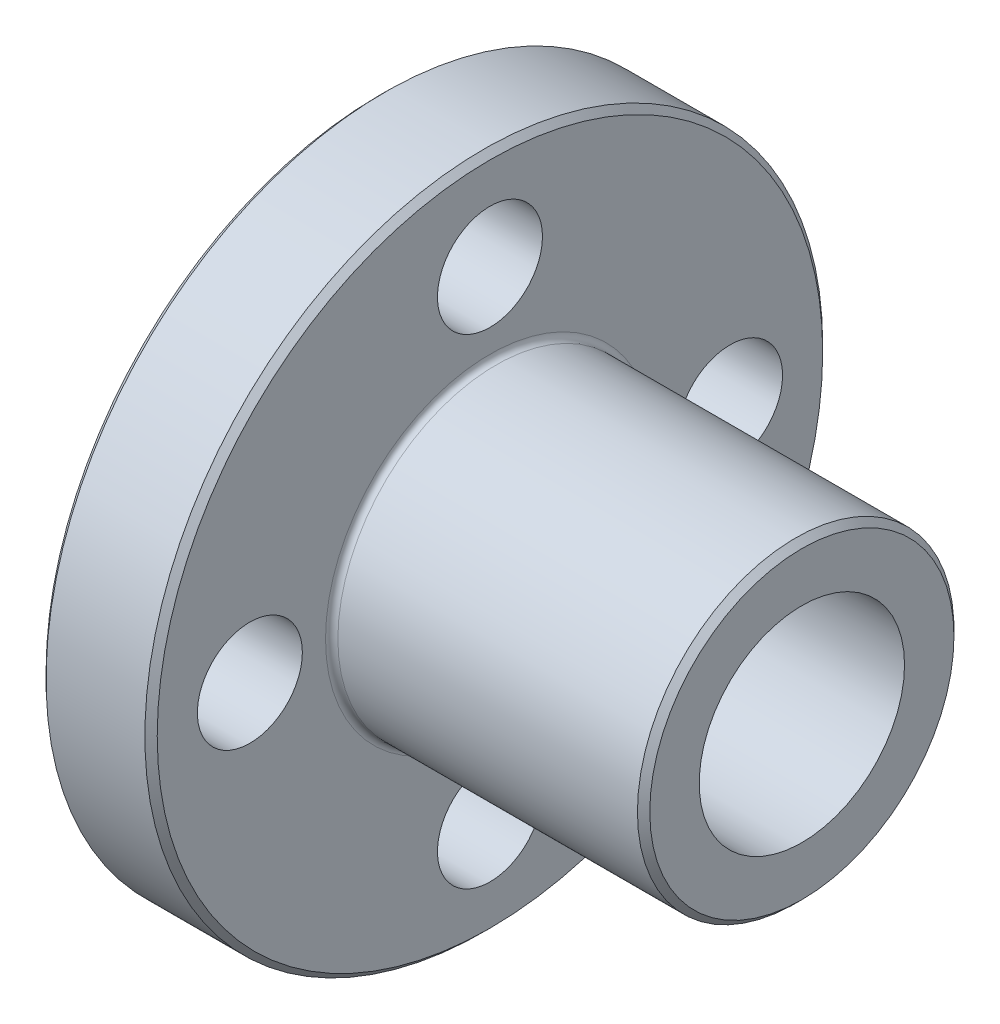
ISO-10303-21;
HEADER;
FILE_DESCRIPTION(('STEP AP214'),'2;1');
FILE_NAME('part.step','',(''),(''),'','','');
FILE_SCHEMA(('AUTOMOTIVE_DESIGN { 1 0 10303 214 1 1 1 1 }'));
ENDSEC;
DATA;
#1=APPLICATION_CONTEXT('core data for automotive mechanical design processes');
#2=APPLICATION_PROTOCOL_DEFINITION('international standard','automotive_design',2000,#1);
#3=PRODUCT_CONTEXT('',#1,'mechanical');
#4=PRODUCT('Part','Part','',(#3));
#5=PRODUCT_RELATED_PRODUCT_CATEGORY('part','',(#4));
#6=PRODUCT_DEFINITION_FORMATION('','',#4);
#7=PRODUCT_DEFINITION_CONTEXT('part definition',#1,'design');
#8=PRODUCT_DEFINITION('design','',#6,#7);
#9=PRODUCT_DEFINITION_SHAPE('','',#8);
#10=(LENGTH_UNIT() NAMED_UNIT(*) SI_UNIT(.MILLI.,.METRE.));
#11=(NAMED_UNIT(*) PLANE_ANGLE_UNIT() SI_UNIT($,.RADIAN.));
#12=(NAMED_UNIT(*) SI_UNIT($,.STERADIAN.) SOLID_ANGLE_UNIT());
#13=UNCERTAINTY_MEASURE_WITH_UNIT(LENGTH_MEASURE(1.E-05),#10,'distance_accuracy_value','');
#14=(GEOMETRIC_REPRESENTATION_CONTEXT(3) GLOBAL_UNCERTAINTY_ASSIGNED_CONTEXT((#13)) GLOBAL_UNIT_ASSIGNED_CONTEXT((#10,
#11,#12)) REPRESENTATION_CONTEXT('',''));
#15=CARTESIAN_POINT('',(0.,0.,0.));
#16=DIRECTION('',(0.,0.,1.));
#17=DIRECTION('',(1.,0.,0.));
#18=AXIS2_PLACEMENT_3D('',#15,#16,#17);
#19=CARTESIAN_POINT('',(3.6,0.,0.));
#20=DIRECTION('',(1.,0.,0.));
#21=DIRECTION('',(0.,0.,-1.));
#22=AXIS2_PLACEMENT_3D('',#19,#20,#21);
#23=PLANE('',#22);
#24=CARTESIAN_POINT('',(3.6,0.,0.));
#25=DIRECTION('',(1.,0.,0.));
#26=DIRECTION('',(0.,0.,-1.));
#27=AXIS2_PLACEMENT_3D('',#24,#25,#26);
#28=CIRCLE('',#27,10.775);
#29=CARTESIAN_POINT('',(3.6,0.,-10.775));
#30=VERTEX_POINT('',#29);
#31=EDGE_CURVE('E10',#30,#30,#28,.T.);
#32=ORIENTED_EDGE('',*,*,#31,.T.);
#33=EDGE_LOOP('',(#32));
#34=FACE_BOUND('',#33,.T.);
#35=CARTESIAN_POINT('',(3.6,0.,0.));
#36=DIRECTION('',(1.,0.,0.));
#37=DIRECTION('',(0.,0.,-1.));
#38=AXIS2_PLACEMENT_3D('',#35,#36,#37);
#39=CIRCLE('',#38,5.325);
#40=CARTESIAN_POINT('',(3.6,0.,-5.325));
#41=VERTEX_POINT('',#40);
#42=EDGE_CURVE('E76',#41,#41,#39,.F.);
#43=ORIENTED_EDGE('',*,*,#42,.T.);
#44=EDGE_LOOP('',(#43));
#45=FACE_BOUND('',#44,.T.);
#46=CARTESIAN_POINT('',(3.6,-7.775,0.));
#47=DIRECTION('',(1.,0.,0.));
#48=DIRECTION('',(0.,0.,-1.));
#49=AXIS2_PLACEMENT_3D('',#46,#47,#48);
#50=CIRCLE('',#49,1.7);
#51=CARTESIAN_POINT('',(3.6,-7.775,-1.7));
#52=VERTEX_POINT('',#51);
#53=EDGE_CURVE('E93',#52,#52,#50,.T.);
#54=ORIENTED_EDGE('',*,*,#53,.F.);
#55=EDGE_LOOP('',(#54));
#56=FACE_BOUND('',#55,.T.);
#57=CARTESIAN_POINT('',(3.6,7.775,0.));
#58=DIRECTION('',(1.,0.,0.));
#59=DIRECTION('',(0.,0.,-1.));
#60=AXIS2_PLACEMENT_3D('',#57,#58,#59);
#61=CIRCLE('',#60,1.7);
#62=CARTESIAN_POINT('',(3.6,7.775,-1.7));
#63=VERTEX_POINT('',#62);
#64=EDGE_CURVE('E80',#63,#63,#61,.T.);
#65=ORIENTED_EDGE('',*,*,#64,.F.);
#66=EDGE_LOOP('',(#65));
#67=FACE_BOUND('',#66,.T.);
#68=CARTESIAN_POINT('',(3.6,0.,-7.77500000000001));
#69=DIRECTION('',(1.,0.,0.));
#70=DIRECTION('',(0.,0.,-1.));
#71=AXIS2_PLACEMENT_3D('',#68,#69,#70);
#72=CIRCLE('',#71,1.7);
#73=CARTESIAN_POINT('',(3.6,0.,-9.47500000000001));
#74=VERTEX_POINT('',#73);
#75=EDGE_CURVE('E85',#74,#74,#72,.T.);
#76=ORIENTED_EDGE('',*,*,#75,.F.);
#77=EDGE_LOOP('',(#76));
#78=FACE_BOUND('',#77,.T.);
#79=CARTESIAN_POINT('',(3.6,0.,7.775));
#80=DIRECTION('',(1.,0.,0.));
#81=DIRECTION('',(0.,0.,-1.));
#82=AXIS2_PLACEMENT_3D('',#79,#80,#81);
#83=CIRCLE('',#82,1.7);
#84=CARTESIAN_POINT('',(3.6,0.,6.075));
#85=VERTEX_POINT('',#84);
#86=EDGE_CURVE('E101',#85,#85,#83,.T.);
#87=ORIENTED_EDGE('',*,*,#86,.F.);
#88=EDGE_LOOP('',(#87));
#89=FACE_BOUND('',#88,.T.);
#90=ADVANCED_FACE('F39',(#34,#45,#56,#67,#78,#89),#23,.T.);
#91=CARTESIAN_POINT('',(0.,0.,0.));
#92=DIRECTION('',(1.,0.,0.));
#93=DIRECTION('',(0.,0.,-1.));
#94=AXIS2_PLACEMENT_3D('',#91,#92,#93);
#95=PLANE('',#94);
#96=CARTESIAN_POINT('',(0.,0.,0.));
#97=DIRECTION('',(1.,0.,0.));
#98=DIRECTION('',(0.,0.,-1.));
#99=AXIS2_PLACEMENT_3D('',#96,#97,#98);
#100=CIRCLE('',#99,10.775);
#101=CARTESIAN_POINT('',(0.,0.,-10.775));
#102=VERTEX_POINT('',#101);
#103=EDGE_CURVE('E48',#102,#102,#100,.F.);
#104=ORIENTED_EDGE('',*,*,#103,.T.);
#105=EDGE_LOOP('',(#104));
#106=FACE_BOUND('',#105,.T.);
#107=CARTESIAN_POINT('',(0.,0.,0.));
#108=DIRECTION('',(1.,0.,0.));
#109=DIRECTION('',(0.,0.,-1.));
#110=AXIS2_PLACEMENT_3D('',#107,#108,#109);
#111=CIRCLE('',#110,5.125);
#112=CARTESIAN_POINT('',(0.,0.,-5.125));
#113=VERTEX_POINT('',#112);
#114=EDGE_CURVE('E109',#113,#113,#111,.T.);
#115=ORIENTED_EDGE('',*,*,#114,.T.);
#116=EDGE_LOOP('',(#115));
#117=FACE_BOUND('',#116,.T.);
#118=CARTESIAN_POINT('',(0.,7.775,0.));
#119=DIRECTION('',(1.,0.,0.));
#120=DIRECTION('',(0.,0.,-1.));
#121=AXIS2_PLACEMENT_3D('',#118,#119,#120);
#122=CIRCLE('',#121,1.7);
#123=CARTESIAN_POINT('',(0.,7.775,-1.7));
#124=VERTEX_POINT('',#123);
#125=EDGE_CURVE('E81',#124,#124,#122,.T.);
#126=ORIENTED_EDGE('',*,*,#125,.T.);
#127=EDGE_LOOP('',(#126));
#128=FACE_BOUND('',#127,.T.);
#129=CARTESIAN_POINT('',(0.,0.,-7.77500000000001));
#130=DIRECTION('',(1.,0.,0.));
#131=DIRECTION('',(0.,0.,-1.));
#132=AXIS2_PLACEMENT_3D('',#129,#130,#131);
#133=CIRCLE('',#132,1.7);
#134=CARTESIAN_POINT('',(0.,0.,-9.47500000000001));
#135=VERTEX_POINT('',#134);
#136=EDGE_CURVE('E89',#135,#135,#133,.T.);
#137=ORIENTED_EDGE('',*,*,#136,.T.);
#138=EDGE_LOOP('',(#137));
#139=FACE_BOUND('',#138,.T.);
#140=CARTESIAN_POINT('',(0.,-7.775,0.));
#141=DIRECTION('',(1.,0.,0.));
#142=DIRECTION('',(0.,0.,-1.));
#143=AXIS2_PLACEMENT_3D('',#140,#141,#142);
#144=CIRCLE('',#143,1.7);
#145=CARTESIAN_POINT('',(0.,-7.775,-1.7));
#146=VERTEX_POINT('',#145);
#147=EDGE_CURVE('E97',#146,#146,#144,.T.);
#148=ORIENTED_EDGE('',*,*,#147,.T.);
#149=EDGE_LOOP('',(#148));
#150=FACE_BOUND('',#149,.T.);
#151=CARTESIAN_POINT('',(0.,0.,7.775));
#152=DIRECTION('',(1.,0.,0.));
#153=DIRECTION('',(0.,0.,-1.));
#154=AXIS2_PLACEMENT_3D('',#151,#152,#153);
#155=CIRCLE('',#154,1.7);
#156=CARTESIAN_POINT('',(0.,0.,6.075));
#157=VERTEX_POINT('',#156);
#158=EDGE_CURVE('E105',#157,#157,#155,.T.);
#159=ORIENTED_EDGE('',*,*,#158,.T.);
#160=EDGE_LOOP('',(#159));
#161=FACE_BOUND('',#160,.T.);
#162=ADVANCED_FACE('F148',(#106,#117,#128,#139,#150,#161),#95,.F.);
#163=CARTESIAN_POINT('',(3.6,0.,0.));
#164=DIRECTION('',(-1.,0.,0.));
#165=DIRECTION('',(0.,0.,1.));
#166=AXIS2_PLACEMENT_3D('',#163,#164,#165);
#167=CYLINDRICAL_SURFACE('',#166,10.975);
#168=CARTESIAN_POINT('',(0.199999999999997,0.,0.));
#169=DIRECTION('',(1.,0.,0.));
#170=DIRECTION('',(0.,0.,-1.));
#171=AXIS2_PLACEMENT_3D('',#168,#169,#170);
#172=CIRCLE('',#171,10.975);
#173=CARTESIAN_POINT('',(0.199999999999997,0.,-10.975));
#174=VERTEX_POINT('',#173);
#175=EDGE_CURVE('E53',#174,#174,#172,.T.);
#176=ORIENTED_EDGE('',*,*,#175,.T.);
#177=EDGE_LOOP('',(#176));
#178=FACE_BOUND('',#177,.T.);
#179=CARTESIAN_POINT('',(3.4,0.,0.));
#180=DIRECTION('',(1.,0.,0.));
#181=DIRECTION('',(0.,0.,-1.));
#182=AXIS2_PLACEMENT_3D('',#179,#180,#181);
#183=CIRCLE('',#182,10.975);
#184=CARTESIAN_POINT('',(3.4,0.,-10.975));
#185=VERTEX_POINT('',#184);
#186=EDGE_CURVE('E58',#185,#185,#183,.F.);
#187=ORIENTED_EDGE('',*,*,#186,.T.);
#188=EDGE_LOOP('',(#187));
#189=FACE_BOUND('',#188,.T.);
#190=ADVANCED_FACE('F153',(#178,#189),#167,.T.);
#191=CARTESIAN_POINT('',(3.6,7.775,0.));
#192=DIRECTION('',(-1.,0.,0.));
#193=DIRECTION('',(0.,0.,1.));
#194=AXIS2_PLACEMENT_3D('',#191,#192,#193);
#195=CYLINDRICAL_SURFACE('',#194,1.7);
#196=ORIENTED_EDGE('',*,*,#64,.T.);
#197=EDGE_LOOP('',(#196));
#198=FACE_BOUND('',#197,.T.);
#199=ORIENTED_EDGE('',*,*,#125,.F.);
#200=EDGE_LOOP('',(#199));
#201=FACE_BOUND('',#200,.T.);
#202=ADVANCED_FACE('F157',(#198,#201),#195,.F.);
#203=CARTESIAN_POINT('',(3.6,0.,-7.77500000000001));
#204=DIRECTION('',(-1.,0.,0.));
#205=DIRECTION('',(0.,0.,1.));
#206=AXIS2_PLACEMENT_3D('',#203,#204,#205);
#207=CYLINDRICAL_SURFACE('',#206,1.7);
#208=ORIENTED_EDGE('',*,*,#75,.T.);
#209=EDGE_LOOP('',(#208));
#210=FACE_BOUND('',#209,.T.);
#211=ORIENTED_EDGE('',*,*,#136,.F.);
#212=EDGE_LOOP('',(#211));
#213=FACE_BOUND('',#212,.T.);
#214=ADVANCED_FACE('F277',(#210,#213),#207,.F.);
#215=CARTESIAN_POINT('',(3.6,-7.775,0.));
#216=DIRECTION('',(-1.,0.,0.));
#217=DIRECTION('',(0.,0.,1.));
#218=AXIS2_PLACEMENT_3D('',#215,#216,#217);
#219=CYLINDRICAL_SURFACE('',#218,1.7);
#220=ORIENTED_EDGE('',*,*,#53,.T.);
#221=EDGE_LOOP('',(#220));
#222=FACE_BOUND('',#221,.T.);
#223=ORIENTED_EDGE('',*,*,#147,.F.);
#224=EDGE_LOOP('',(#223));
#225=FACE_BOUND('',#224,.T.);
#226=ADVANCED_FACE('F267',(#222,#225),#219,.F.);
#227=CARTESIAN_POINT('',(3.6,0.,7.775));
#228=DIRECTION('',(-1.,0.,0.));
#229=DIRECTION('',(0.,0.,1.));
#230=AXIS2_PLACEMENT_3D('',#227,#228,#229);
#231=CYLINDRICAL_SURFACE('',#230,1.7);
#232=ORIENTED_EDGE('',*,*,#86,.T.);
#233=EDGE_LOOP('',(#232));
#234=FACE_BOUND('',#233,.T.);
#235=ORIENTED_EDGE('',*,*,#158,.F.);
#236=EDGE_LOOP('',(#235));
#237=FACE_BOUND('',#236,.T.);
#238=ADVANCED_FACE('F144',(#234,#237),#231,.F.);
#239=CARTESIAN_POINT('',(13.7,0.,0.));
#240=DIRECTION('',(-1.,0.,0.));
#241=DIRECTION('',(0.,0.,1.));
#242=AXIS2_PLACEMENT_3D('',#239,#240,#241);
#243=CYLINDRICAL_SURFACE('',#242,5.125);
#244=CARTESIAN_POINT('',(13.5,0.,0.));
#245=DIRECTION('',(1.,0.,0.));
#246=DIRECTION('',(0.,0.,-1.));
#247=AXIS2_PLACEMENT_3D('',#244,#245,#246);
#248=CIRCLE('',#247,5.125);
#249=CARTESIAN_POINT('',(13.5,0.,5.125));
#250=VERTEX_POINT('',#249);
#251=EDGE_CURVE('E64',#250,#250,#248,.F.);
#252=CARTESIAN_POINT('',(3.8,0.,0.));
#253=DIRECTION('',(1.,0.,0.));
#254=DIRECTION('',(0.,0.,-1.));
#255=AXIS2_PLACEMENT_3D('',#252,#253,#254);
#256=CIRCLE('',#255,5.125);
#257=CARTESIAN_POINT('',(3.8,0.,5.125));
#258=VERTEX_POINT('',#257);
#259=EDGE_CURVE('E72',#258,#258,#256,.T.);
#260=CARTESIAN_POINT('',(13.5,0.,5.125));
#261=CARTESIAN_POINT('',(13.3989583333333,0.,5.125));
#262=CARTESIAN_POINT('',(13.2979166666667,0.,5.125));
#263=CARTESIAN_POINT('',(13.0958333333333,0.,5.125));
#264=CARTESIAN_POINT('',(12.9947916666667,0.,5.125));
#265=CARTESIAN_POINT('',(12.7927083333333,0.,5.125));
#266=CARTESIAN_POINT('',(12.6916666666667,0.,5.125));
#267=CARTESIAN_POINT('',(12.4895833333333,0.,5.125));
#268=CARTESIAN_POINT('',(12.3885416666667,0.,5.125));
#269=CARTESIAN_POINT('',(12.1864583333333,0.,5.125));
#270=CARTESIAN_POINT('',(12.0854166666667,0.,5.125));
#271=CARTESIAN_POINT('',(11.8833333333333,0.,5.125));
#272=CARTESIAN_POINT('',(11.7822916666667,0.,5.125));
#273=CARTESIAN_POINT('',(11.5802083333333,0.,5.125));
#274=CARTESIAN_POINT('',(11.4791666666667,0.,5.125));
#275=CARTESIAN_POINT('',(11.2770833333333,0.,5.125));
#276=CARTESIAN_POINT('',(11.1760416666667,0.,5.125));
#277=CARTESIAN_POINT('',(10.9739583333333,0.,5.125));
#278=CARTESIAN_POINT('',(10.8729166666667,0.,5.125));
#279=CARTESIAN_POINT('',(10.6708333333333,0.,5.125));
#280=CARTESIAN_POINT('',(10.5697916666667,0.,5.125));
#281=CARTESIAN_POINT('',(10.3677083333333,0.,5.125));
#282=CARTESIAN_POINT('',(10.2666666666667,0.,5.125));
#283=CARTESIAN_POINT('',(10.0645833333333,0.,5.125));
#284=CARTESIAN_POINT('',(9.96354166666667,0.,5.125));
#285=CARTESIAN_POINT('',(9.76145833333334,0.,5.125));
#286=CARTESIAN_POINT('',(9.66041666666667,0.,5.125));
#287=CARTESIAN_POINT('',(9.45833333333334,0.,5.125));
#288=CARTESIAN_POINT('',(9.35729166666667,0.,5.125));
#289=CARTESIAN_POINT('',(9.15520833333334,0.,5.125));
#290=CARTESIAN_POINT('',(9.05416666666667,0.,5.125));
#291=CARTESIAN_POINT('',(8.85208333333333,0.,5.125));
#292=CARTESIAN_POINT('',(8.75104166666667,0.,5.125));
#293=CARTESIAN_POINT('',(8.54895833333333,0.,5.125));
#294=CARTESIAN_POINT('',(8.44791666666667,0.,5.125));
#295=CARTESIAN_POINT('',(8.24583333333333,0.,5.125));
#296=CARTESIAN_POINT('',(8.14479166666667,0.,5.125));
#297=CARTESIAN_POINT('',(7.94270833333333,0.,5.125));
#298=CARTESIAN_POINT('',(7.84166666666667,0.,5.125));
#299=CARTESIAN_POINT('',(7.63958333333333,0.,5.125));
#300=CARTESIAN_POINT('',(7.53854166666667,0.,5.125));
#301=CARTESIAN_POINT('',(7.33645833333333,0.,5.125));
#302=CARTESIAN_POINT('',(7.23541666666667,0.,5.125));
#303=CARTESIAN_POINT('',(7.03333333333333,0.,5.125));
#304=CARTESIAN_POINT('',(6.93229166666667,0.,5.125));
#305=CARTESIAN_POINT('',(6.73020833333333,0.,5.125));
#306=CARTESIAN_POINT('',(6.62916666666667,0.,5.125));
#307=CARTESIAN_POINT('',(6.42708333333333,0.,5.125));
#308=CARTESIAN_POINT('',(6.32604166666667,0.,5.125));
#309=CARTESIAN_POINT('',(6.12395833333333,0.,5.125));
#310=CARTESIAN_POINT('',(6.02291666666667,0.,5.125));
#311=CARTESIAN_POINT('',(5.82083333333333,0.,5.125));
#312=CARTESIAN_POINT('',(5.71979166666667,0.,5.125));
#313=CARTESIAN_POINT('',(5.51770833333333,0.,5.125));
#314=CARTESIAN_POINT('',(5.41666666666666,0.,5.125));
#315=CARTESIAN_POINT('',(5.21458333333333,0.,5.125));
#316=CARTESIAN_POINT('',(5.11354166666667,0.,5.125));
#317=CARTESIAN_POINT('',(4.91145833333333,0.,5.125));
#318=CARTESIAN_POINT('',(4.81041666666667,0.,5.125));
#319=CARTESIAN_POINT('',(4.60833333333333,0.,5.125));
#320=CARTESIAN_POINT('',(4.50729166666666,0.,5.125));
#321=CARTESIAN_POINT('',(4.30520833333333,0.,5.125));
#322=CARTESIAN_POINT('',(4.20416666666666,0.,5.125));
#323=CARTESIAN_POINT('',(4.00208333333333,0.,5.125));
#324=CARTESIAN_POINT('',(3.90104166666666,0.,5.125));
#325=CARTESIAN_POINT('',(3.8,0.,5.125));
#326=B_SPLINE_CURVE_WITH_KNOTS('',3,(#260,#261,#262,#263,#264,#265,#266,#267,#268,#269,#270,
#271,#272,#273,#274,#275,#276,#277,#278,#279,#280,#281,#282,#283,#284,#285,#286,#287,#288,#289,
#290,#291,#292,#293,#294,#295,#296,#297,#298,#299,#300,#301,#302,#303,#304,#305,#306,#307,#308,
#309,#310,#311,#312,#313,#314,#315,#316,#317,#318,#319,#320,#321,#322,#323,#324,#325),
.UNSPECIFIED.,.F.,.F.,(4,2,2,2,2,2,2,2,2,2,2,2,2,2,2,2,2,2,2,2,2,2,2,2,2,2,2,2,2,2,2,2,4),(0.,
0.303125000000001,0.606250000000001,0.909375000000002,1.2125,1.515625,1.81875,2.121875,2.425,
2.728125,3.03125,3.334375,3.6375,3.940625,4.24375,4.546875,4.85,5.15312500000001,
5.45625000000001,5.75937500000001,6.06250000000001,6.36562500000001,6.66875000000001,
6.97187500000001,7.27500000000001,7.57812500000001,7.88125000000001,8.18437500000001,
8.48750000000001,8.79062500000001,9.09375000000001,9.39687500000001,9.70000000000001),.UNSPECIFIED.);
#327=EDGE_CURVE('BSEAM134',#250,#258,#326,.T.);
#328=ORIENTED_EDGE('',*,*,#251,.T.);
#329=ORIENTED_EDGE('',*,*,#259,.T.);
#330=ORIENTED_EDGE('',*,*,#327,.T.);
#331=ORIENTED_EDGE('',*,*,#327,.F.);
#332=EDGE_LOOP('',(#328,#330,#329,#331));
#333=FACE_BOUND('',#332,.T.);
#334=ADVANCED_FACE('F134',(#333),#243,.T.);
#335=CARTESIAN_POINT('',(13.7,0.,0.));
#336=DIRECTION('',(1.,0.,0.));
#337=DIRECTION('',(0.,0.,-1.));
#338=AXIS2_PLACEMENT_3D('',#335,#336,#337);
#339=PLANE('',#338);
#340=CARTESIAN_POINT('',(13.7,0.,0.));
#341=DIRECTION('',(1.,0.,0.));
#342=DIRECTION('',(0.,0.,-1.));
#343=AXIS2_PLACEMENT_3D('',#340,#341,#342);
#344=CIRCLE('',#343,4.92500000000001);
#345=CARTESIAN_POINT('',(13.7,0.,-4.92500000000001));
#346=VERTEX_POINT('',#345);
#347=EDGE_CURVE('E68',#346,#346,#344,.T.);
#348=ORIENTED_EDGE('',*,*,#347,.T.);
#349=EDGE_LOOP('',(#348));
#350=FACE_BOUND('',#349,.T.);
#351=CARTESIAN_POINT('',(13.7,0.,0.));
#352=DIRECTION('',(1.,0.,0.));
#353=DIRECTION('',(0.,0.,-1.));
#354=AXIS2_PLACEMENT_3D('',#351,#352,#353);
#355=CIRCLE('',#354,3.325);
#356=CARTESIAN_POINT('',(13.7,0.,-3.325));
#357=VERTEX_POINT('',#356);
#358=EDGE_CURVE('E124',#357,#357,#355,.T.);
#359=ORIENTED_EDGE('',*,*,#358,.F.);
#360=EDGE_LOOP('',(#359));
#361=FACE_BOUND('',#360,.T.);
#362=ADVANCED_FACE('F131',(#350,#361),#339,.T.);
#363=CARTESIAN_POINT('',(-1.3,0.,0.));
#364=DIRECTION('',(1.,0.,0.));
#365=DIRECTION('',(0.,0.,-1.));
#366=AXIS2_PLACEMENT_3D('',#363,#364,#365);
#367=CYLINDRICAL_SURFACE('',#366,5.125);
#368=CARTESIAN_POINT('',(-1.3,0.,0.));
#369=DIRECTION('',(1.,0.,0.));
#370=DIRECTION('',(0.,0.,-1.));
#371=AXIS2_PLACEMENT_3D('',#368,#369,#370);
#372=CIRCLE('',#371,5.125);
#373=CARTESIAN_POINT('',(-1.3,0.,-5.125));
#374=VERTEX_POINT('',#373);
#375=EDGE_CURVE('E116',#374,#374,#372,.T.);
#376=ORIENTED_EDGE('',*,*,#375,.T.);
#377=EDGE_LOOP('',(#376));
#378=FACE_BOUND('',#377,.T.);
#379=ORIENTED_EDGE('',*,*,#114,.F.);
#380=EDGE_LOOP('',(#379));
#381=FACE_BOUND('',#380,.T.);
#382=ADVANCED_FACE('F133',(#378,#381),#367,.T.);
#383=CARTESIAN_POINT('',(-1.3,0.,0.));
#384=DIRECTION('',(1.,0.,0.));
#385=DIRECTION('',(0.,0.,-1.));
#386=AXIS2_PLACEMENT_3D('',#383,#384,#385);
#387=PLANE('',#386);
#388=CARTESIAN_POINT('',(-1.3,0.,0.));
#389=DIRECTION('',(1.,0.,0.));
#390=DIRECTION('',(0.,0.,-1.));
#391=AXIS2_PLACEMENT_3D('',#388,#389,#390);
#392=CIRCLE('',#391,3.325);
#393=CARTESIAN_POINT('',(-1.3,0.,-3.325));
#394=VERTEX_POINT('',#393);
#395=EDGE_CURVE('E120',#394,#394,#392,.T.);
#396=ORIENTED_EDGE('',*,*,#395,.T.);
#397=EDGE_LOOP('',(#396));
#398=FACE_BOUND('',#397,.T.);
#399=ORIENTED_EDGE('',*,*,#375,.F.);
#400=EDGE_LOOP('',(#399));
#401=FACE_BOUND('',#400,.T.);
#402=ADVANCED_FACE('F141',(#398,#401),#387,.F.);
#403=CARTESIAN_POINT('',(-1.3,0.,0.));
#404=DIRECTION('',(1.,0.,0.));
#405=DIRECTION('',(0.,0.,-1.));
#406=AXIS2_PLACEMENT_3D('',#403,#404,#405);
#407=CYLINDRICAL_SURFACE('',#406,3.325);
#408=ORIENTED_EDGE('',*,*,#395,.F.);
#409=EDGE_LOOP('',(#408));
#410=FACE_BOUND('',#409,.T.);
#411=ORIENTED_EDGE('',*,*,#358,.T.);
#412=EDGE_LOOP('',(#411));
#413=FACE_BOUND('',#412,.T.);
#414=ADVANCED_FACE('F129',(#410,#413),#407,.F.);
#415=CARTESIAN_POINT('',(3.8,0.,0.));
#416=DIRECTION('',(1.,0.,0.));
#417=DIRECTION('',(0.,0.,-1.));
#418=AXIS2_PLACEMENT_3D('',#415,#416,#417);
#419=TOROIDAL_SURFACE('',#418,5.325,0.2);
#420=ORIENTED_EDGE('',*,*,#259,.F.);
#421=EDGE_LOOP('',(#420));
#422=FACE_BOUND('',#421,.T.);
#423=ORIENTED_EDGE('',*,*,#42,.F.);
#424=EDGE_LOOP('',(#423));
#425=FACE_BOUND('',#424,.T.);
#426=ADVANCED_FACE('F163',(#422,#425),#419,.F.);
#427=CARTESIAN_POINT('',(13.7,0.,0.));
#428=DIRECTION('',(-1.,0.,0.));
#429=DIRECTION('',(0.,0.,1.));
#430=AXIS2_PLACEMENT_3D('',#427,#428,#429);
#431=CONICAL_SURFACE('',#430,4.92500000000001,0.78539816339744);
#432=ORIENTED_EDGE('',*,*,#251,.F.);
#433=EDGE_LOOP('',(#432));
#434=FACE_BOUND('',#433,.T.);
#435=ORIENTED_EDGE('',*,*,#347,.F.);
#436=EDGE_LOOP('',(#435));
#437=FACE_BOUND('',#436,.T.);
#438=ADVANCED_FACE('F166',(#434,#437),#431,.T.);
#439=CARTESIAN_POINT('',(0.199999999999997,0.,0.));
#440=DIRECTION('',(1.,0.,0.));
#441=DIRECTION('',(0.,0.,-1.));
#442=AXIS2_PLACEMENT_3D('',#439,#440,#441);
#443=CONICAL_SURFACE('',#442,10.975,0.785398163397453);
#444=ORIENTED_EDGE('',*,*,#103,.F.);
#445=EDGE_LOOP('',(#444));
#446=FACE_BOUND('',#445,.T.);
#447=ORIENTED_EDGE('',*,*,#175,.F.);
#448=EDGE_LOOP('',(#447));
#449=FACE_BOUND('',#448,.T.);
#450=ADVANCED_FACE('F173',(#446,#449),#443,.T.);
#451=CARTESIAN_POINT('',(3.6,0.,0.));
#452=DIRECTION('',(-1.,0.,0.));
#453=DIRECTION('',(0.,0.,1.));
#454=AXIS2_PLACEMENT_3D('',#451,#452,#453);
#455=CONICAL_SURFACE('',#454,10.775,0.785398163397448);
#456=ORIENTED_EDGE('',*,*,#186,.F.);
#457=EDGE_LOOP('',(#456));
#458=FACE_BOUND('',#457,.T.);
#459=ORIENTED_EDGE('',*,*,#31,.F.);
#460=EDGE_LOOP('',(#459));
#461=FACE_BOUND('',#460,.T.);
#462=ADVANCED_FACE('F42',(#458,#461),#455,.T.);
#463=CLOSED_SHELL('',(#90,#162,#190,#202,#214,#226,#238,#334,#362,#382,#402,#414,#426,#438,#450,#462));
#464=MANIFOLD_SOLID_BREP('B2',#463);
#465=ADVANCED_BREP_SHAPE_REPRESENTATION('',(#18,#464),#14);
#466=SHAPE_DEFINITION_REPRESENTATION(#9,#465);
ENDSEC;
END-ISO-10303-21;
